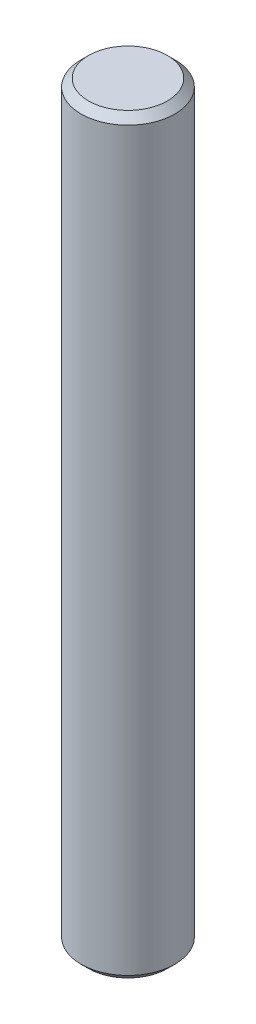
ISO-10303-21;
HEADER;
FILE_DESCRIPTION(('STEP AP214'),'2;1');
FILE_NAME('part.step','',(''),(''),'','','');
FILE_SCHEMA(('AUTOMOTIVE_DESIGN { 1 0 10303 214 1 1 1 1 }'));
ENDSEC;
DATA;
#1=APPLICATION_CONTEXT('core data for automotive mechanical design processes');
#2=APPLICATION_PROTOCOL_DEFINITION('international standard','automotive_design',2000,#1);
#3=PRODUCT_CONTEXT('',#1,'mechanical');
#4=PRODUCT('Part','Part','',(#3));
#5=PRODUCT_RELATED_PRODUCT_CATEGORY('part','',(#4));
#6=PRODUCT_DEFINITION_FORMATION('','',#4);
#7=PRODUCT_DEFINITION_CONTEXT('part definition',#1,'design');
#8=PRODUCT_DEFINITION('design','',#6,#7);
#9=PRODUCT_DEFINITION_SHAPE('','',#8);
#10=(LENGTH_UNIT() NAMED_UNIT(*) SI_UNIT(.MILLI.,.METRE.));
#11=(NAMED_UNIT(*) PLANE_ANGLE_UNIT() SI_UNIT($,.RADIAN.));
#12=(NAMED_UNIT(*) SI_UNIT($,.STERADIAN.) SOLID_ANGLE_UNIT());
#13=UNCERTAINTY_MEASURE_WITH_UNIT(LENGTH_MEASURE(1.E-05),#10,'distance_accuracy_value','');
#14=(GEOMETRIC_REPRESENTATION_CONTEXT(3) GLOBAL_UNCERTAINTY_ASSIGNED_CONTEXT((#13)) GLOBAL_UNIT_ASSIGNED_CONTEXT((#10,
#11,#12)) REPRESENTATION_CONTEXT('',''));
#15=CARTESIAN_POINT('',(0.,0.,0.));
#16=DIRECTION('',(0.,0.,1.));
#17=DIRECTION('',(1.,0.,0.));
#18=AXIS2_PLACEMENT_3D('',#15,#16,#17);
#19=CARTESIAN_POINT('',(0.,200.,0.));
#20=DIRECTION('',(0.,-1.,0.));
#21=DIRECTION('',(0.,0.,-1.));
#22=AXIS2_PLACEMENT_3D('',#19,#20,#21);
#23=CYLINDRICAL_SURFACE('',#22,12.5);
#24=CARTESIAN_POINT('',(0.,2.00000000000003,0.));
#25=DIRECTION('',(0.,1.,0.));
#26=DIRECTION('',(0.,0.,1.));
#27=AXIS2_PLACEMENT_3D('',#24,#25,#26);
#28=CIRCLE('',#27,12.5);
#29=CARTESIAN_POINT('',(0.,2.00000000000003,12.5));
#30=VERTEX_POINT('',#29);
#31=EDGE_CURVE('E59',#30,#30,#28,.T.);
#32=ORIENTED_EDGE('',*,*,#31,.T.);
#33=EDGE_LOOP('',(#32));
#34=FACE_BOUND('',#33,.T.);
#35=CARTESIAN_POINT('',(0.,198.,0.));
#36=DIRECTION('',(0.,1.,0.));
#37=DIRECTION('',(0.,0.,1.));
#38=AXIS2_PLACEMENT_3D('',#35,#36,#37);
#39=CIRCLE('',#38,12.5);
#40=CARTESIAN_POINT('',(0.,198.,12.5));
#41=VERTEX_POINT('',#40);
#42=EDGE_CURVE('E64',#41,#41,#39,.F.);
#43=ORIENTED_EDGE('',*,*,#42,.T.);
#44=EDGE_LOOP('',(#43));
#45=FACE_BOUND('',#44,.T.);
#46=ADVANCED_FACE('F45',(#34,#45),#23,.T.);
#47=CARTESIAN_POINT('',(0.,200.,0.));
#48=DIRECTION('',(0.,1.,0.));
#49=DIRECTION('',(0.,0.,1.));
#50=AXIS2_PLACEMENT_3D('',#47,#48,#49);
#51=PLANE('',#50);
#52=CARTESIAN_POINT('',(0.,200.,0.));
#53=DIRECTION('',(0.,1.,0.));
#54=DIRECTION('',(0.,0.,1.));
#55=AXIS2_PLACEMENT_3D('',#52,#53,#54);
#56=CIRCLE('',#55,10.5);
#57=CARTESIAN_POINT('',(0.,200.,10.5));
#58=VERTEX_POINT('',#57);
#59=EDGE_CURVE('E10',#58,#58,#56,.T.);
#60=ORIENTED_EDGE('',*,*,#59,.T.);
#61=EDGE_LOOP('',(#60));
#62=FACE_BOUND('',#61,.T.);
#63=ADVANCED_FACE('F81',(#62),#51,.T.);
#64=CARTESIAN_POINT('',(0.,0.,0.));
#65=DIRECTION('',(0.,1.,0.));
#66=DIRECTION('',(0.,0.,1.));
#67=AXIS2_PLACEMENT_3D('',#64,#65,#66);
#68=PLANE('',#67);
#69=CARTESIAN_POINT('',(0.,0.,0.));
#70=DIRECTION('',(0.,1.,0.));
#71=DIRECTION('',(0.,0.,1.));
#72=AXIS2_PLACEMENT_3D('',#69,#70,#71);
#73=CIRCLE('',#72,10.5);
#74=CARTESIAN_POINT('',(0.,0.,10.5));
#75=VERTEX_POINT('',#74);
#76=EDGE_CURVE('E54',#75,#75,#73,.F.);
#77=ORIENTED_EDGE('',*,*,#76,.T.);
#78=EDGE_LOOP('',(#77));
#79=FACE_BOUND('',#78,.T.);
#80=ADVANCED_FACE('F78',(#79),#68,.F.);
#81=CARTESIAN_POINT('',(0.,2.00000000000003,0.));
#82=DIRECTION('',(0.,1.,0.));
#83=DIRECTION('',(0.,0.,1.));
#84=AXIS2_PLACEMENT_3D('',#81,#82,#83);
#85=CONICAL_SURFACE('',#84,12.5,0.785398163397446);
#86=ORIENTED_EDGE('',*,*,#76,.F.);
#87=EDGE_LOOP('',(#86));
#88=FACE_BOUND('',#87,.T.);
#89=ORIENTED_EDGE('',*,*,#31,.F.);
#90=EDGE_LOOP('',(#89));
#91=FACE_BOUND('',#90,.T.);
#92=ADVANCED_FACE('F74',(#88,#91),#85,.T.);
#93=CARTESIAN_POINT('',(0.,200.,0.));
#94=DIRECTION('',(0.,-1.,0.));
#95=DIRECTION('',(0.,0.,-1.));
#96=AXIS2_PLACEMENT_3D('',#93,#94,#95);
#97=CONICAL_SURFACE('',#96,10.5,0.785398163397446);
#98=ORIENTED_EDGE('',*,*,#42,.F.);
#99=EDGE_LOOP('',(#98));
#100=FACE_BOUND('',#99,.T.);
#101=ORIENTED_EDGE('',*,*,#59,.F.);
#102=EDGE_LOOP('',(#101));
#103=FACE_BOUND('',#102,.T.);
#104=ADVANCED_FACE('F48',(#100,#103),#97,.T.);
#105=CLOSED_SHELL('',(#46,#63,#80,#92,#104));
#106=MANIFOLD_SOLID_BREP('B2',#105);
#107=ADVANCED_BREP_SHAPE_REPRESENTATION('',(#18,#106),#14);
#108=SHAPE_DEFINITION_REPRESENTATION(#9,#107);
ENDSEC;
END-ISO-10303-21;
